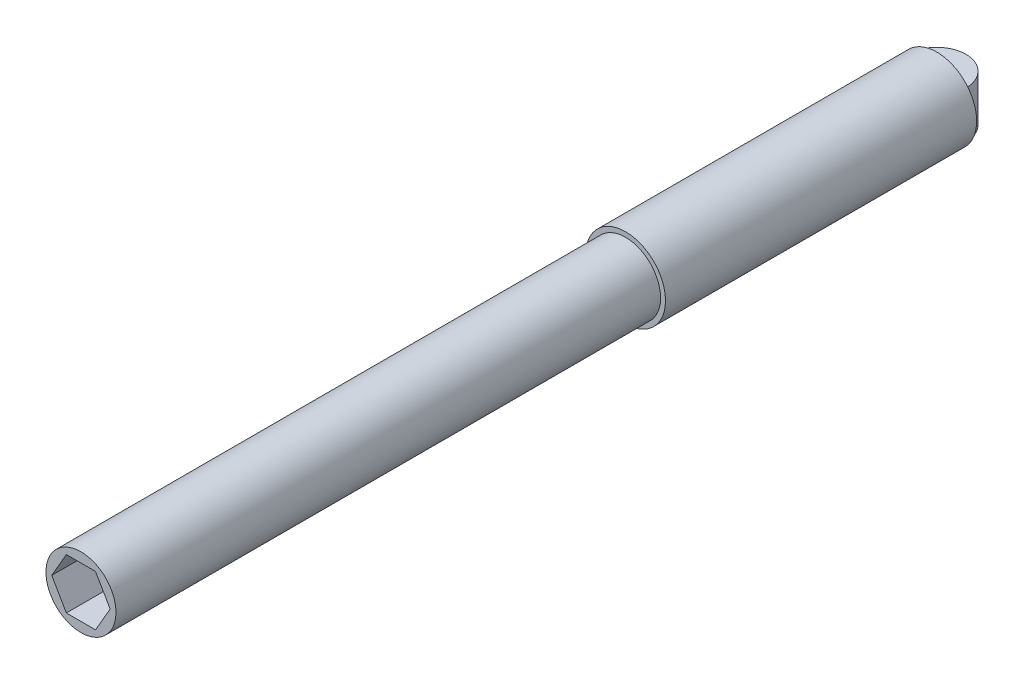
ISO-10303-21;
HEADER;
FILE_DESCRIPTION(('STEP AP214'),'2;1');
FILE_NAME('part.step','',(''),(''),'','','');
FILE_SCHEMA(('AUTOMOTIVE_DESIGN { 1 0 10303 214 1 1 1 1 }'));
ENDSEC;
DATA;
#1=APPLICATION_CONTEXT('core data for automotive mechanical design processes');
#2=APPLICATION_PROTOCOL_DEFINITION('international standard','automotive_design',2000,#1);
#3=PRODUCT_CONTEXT('',#1,'mechanical');
#4=PRODUCT('Part','Part','',(#3));
#5=PRODUCT_RELATED_PRODUCT_CATEGORY('part','',(#4));
#6=PRODUCT_DEFINITION_FORMATION('','',#4);
#7=PRODUCT_DEFINITION_CONTEXT('part definition',#1,'design');
#8=PRODUCT_DEFINITION('design','',#6,#7);
#9=PRODUCT_DEFINITION_SHAPE('','',#8);
#10=(LENGTH_UNIT() NAMED_UNIT(*) SI_UNIT(.MILLI.,.METRE.));
#11=(NAMED_UNIT(*) PLANE_ANGLE_UNIT() SI_UNIT($,.RADIAN.));
#12=(NAMED_UNIT(*) SI_UNIT($,.STERADIAN.) SOLID_ANGLE_UNIT());
#13=UNCERTAINTY_MEASURE_WITH_UNIT(LENGTH_MEASURE(1.E-05),#10,'distance_accuracy_value','');
#14=(GEOMETRIC_REPRESENTATION_CONTEXT(3) GLOBAL_UNCERTAINTY_ASSIGNED_CONTEXT((#13)) GLOBAL_UNIT_ASSIGNED_CONTEXT((#10,
#11,#12)) REPRESENTATION_CONTEXT('',''));
#15=CARTESIAN_POINT('',(0.,0.,0.));
#16=DIRECTION('',(0.,0.,1.));
#17=DIRECTION('',(1.,0.,0.));
#18=AXIS2_PLACEMENT_3D('',#15,#16,#17);
#19=CARTESIAN_POINT('',(0.,0.,2.));
#20=DIRECTION('',(0.,0.,1.));
#21=DIRECTION('',(1.,0.,0.));
#22=AXIS2_PLACEMENT_3D('',#19,#20,#21);
#23=PLANE('',#22);
#24=CARTESIAN_POINT('',(0.,0.,2.));
#25=DIRECTION('',(0.,0.,1.));
#26=DIRECTION('',(1.,0.,0.));
#27=AXIS2_PLACEMENT_3D('',#24,#25,#26);
#28=CIRCLE('',#27,1.025);
#29=CARTESIAN_POINT('',(1.025,0.,2.));
#30=VERTEX_POINT('',#29);
#31=EDGE_CURVE('E204',#30,#30,#28,.T.);
#32=ORIENTED_EDGE('',*,*,#31,.T.);
#33=EDGE_LOOP('',(#32));
#34=FACE_BOUND('',#33,.T.);
#35=CARTESIAN_POINT('',(0.,0.,2.));
#36=DIRECTION('',(0.,0.,1.));
#37=DIRECTION('',(1.,0.,0.));
#38=AXIS2_PLACEMENT_3D('',#35,#36,#37);
#39=CIRCLE('',#38,0.9);
#40=CARTESIAN_POINT('',(0.9,0.,2.));
#41=VERTEX_POINT('',#40);
#42=EDGE_CURVE('E147',#41,#41,#39,.T.);
#43=ORIENTED_EDGE('',*,*,#42,.F.);
#44=EDGE_LOOP('',(#43));
#45=FACE_BOUND('',#44,.T.);
#46=ADVANCED_FACE('F65',(#34,#45),#23,.T.);
#47=CARTESIAN_POINT('',(0.,0.,12.));
#48=DIRECTION('',(0.,0.,-1.));
#49=DIRECTION('',(-1.,0.,0.));
#50=AXIS2_PLACEMENT_3D('',#47,#48,#49);
#51=CYLINDRICAL_SURFACE('',#50,1.025);
#52=CARTESIAN_POINT('',(0.,0.,-6.));
#53=DIRECTION('',(0.,0.,-1.));
#54=DIRECTION('',(-1.,0.,0.));
#55=AXIS2_PLACEMENT_3D('',#52,#53,#54);
#56=CIRCLE('',#55,1.025);
#57=CARTESIAN_POINT('',(-1.025,0.,-6.));
#58=VERTEX_POINT('',#57);
#59=EDGE_CURVE('E12',#58,#58,#56,.T.);
#60=ORIENTED_EDGE('',*,*,#59,.F.);
#61=EDGE_LOOP('',(#60));
#62=FACE_BOUND('',#61,.T.);
#63=ORIENTED_EDGE('',*,*,#31,.F.);
#64=EDGE_LOOP('',(#63));
#65=FACE_BOUND('',#64,.T.);
#66=ADVANCED_FACE('F67',(#62,#65),#51,.T.);
#67=CARTESIAN_POINT('',(0.,0.,-6.));
#68=DIRECTION('',(0.,0.,-1.));
#69=DIRECTION('',(-1.,0.,0.));
#70=AXIS2_PLACEMENT_3D('',#67,#68,#69);
#71=PLANE('',#70);
#72=ORIENTED_EDGE('',*,*,#59,.T.);
#73=EDGE_LOOP('',(#72));
#74=FACE_BOUND('',#73,.T.);
#75=DIRECTION('',(0.,1.,0.));
#76=VECTOR('',#75,1.);
#77=CARTESIAN_POINT('',(-0.75,-0.6,-6.));
#78=LINE('',#77,#76);
#79=CARTESIAN_POINT('',(-0.75,-0.6,-6.));
#80=VERTEX_POINT('',#79);
#81=CARTESIAN_POINT('',(-0.75,0.6,-6.));
#82=VERTEX_POINT('',#81);
#83=EDGE_CURVE('E74',#80,#82,#78,.T.);
#84=ORIENTED_EDGE('',*,*,#83,.F.);
#85=DIRECTION('',(1.,0.,0.));
#86=VECTOR('',#85,1.);
#87=CARTESIAN_POINT('',(0.,-0.6,-6.));
#88=LINE('',#87,#86);
#89=CARTESIAN_POINT('',(0.75,-0.6,-6.));
#90=VERTEX_POINT('',#89);
#91=EDGE_CURVE('E219',#80,#90,#88,.T.);
#92=ORIENTED_EDGE('',*,*,#91,.T.);
#93=DIRECTION('',(0.,1.,0.));
#94=VECTOR('',#93,1.);
#95=CARTESIAN_POINT('',(0.75,-0.6,-6.));
#96=LINE('',#95,#94);
#97=CARTESIAN_POINT('',(0.75,0.6,-6.));
#98=VERTEX_POINT('',#97);
#99=EDGE_CURVE('E226',#90,#98,#96,.T.);
#100=ORIENTED_EDGE('',*,*,#99,.T.);
#101=DIRECTION('',(1.,0.,0.));
#102=VECTOR('',#101,1.);
#103=CARTESIAN_POINT('',(0.,0.6,-6.));
#104=LINE('',#103,#102);
#105=EDGE_CURVE('E211',#82,#98,#104,.T.);
#106=ORIENTED_EDGE('',*,*,#105,.F.);
#107=EDGE_LOOP('',(#84,#92,#100,#106));
#108=FACE_BOUND('',#107,.T.);
#109=ADVANCED_FACE('F233',(#74,#108),#71,.T.);
#110=CARTESIAN_POINT('',(0.,-0.6,-6.));
#111=DIRECTION('',(0.,1.,0.));
#112=DIRECTION('',(0.,0.,1.));
#113=AXIS2_PLACEMENT_3D('',#110,#111,#112);
#114=CYLINDRICAL_SURFACE('',#113,0.75);
#115=ORIENTED_EDGE('',*,*,#83,.T.);
#116=CARTESIAN_POINT('',(0.,0.6,-6.));
#117=DIRECTION('',(0.,1.,0.));
#118=DIRECTION('',(0.,0.,1.));
#119=AXIS2_PLACEMENT_3D('',#116,#117,#118);
#120=CIRCLE('',#119,0.75);
#121=EDGE_CURVE('E215',#98,#82,#120,.T.);
#122=ORIENTED_EDGE('',*,*,#121,.F.);
#123=ORIENTED_EDGE('',*,*,#99,.F.);
#124=CARTESIAN_POINT('',(0.,-0.6,-6.));
#125=DIRECTION('',(0.,1.,0.));
#126=DIRECTION('',(0.,0.,1.));
#127=AXIS2_PLACEMENT_3D('',#124,#125,#126);
#128=CIRCLE('',#127,0.75);
#129=EDGE_CURVE('E222',#90,#80,#128,.T.);
#130=ORIENTED_EDGE('',*,*,#129,.T.);
#131=EDGE_LOOP('',(#115,#122,#123,#130));
#132=FACE_BOUND('',#131,.T.);
#133=ADVANCED_FACE('F237',(#132),#114,.T.);
#134=CARTESIAN_POINT('',(0.,-0.6,0.));
#135=DIRECTION('',(0.,1.,0.));
#136=DIRECTION('',(0.,0.,1.));
#137=AXIS2_PLACEMENT_3D('',#134,#135,#136);
#138=PLANE('',#137);
#139=ORIENTED_EDGE('',*,*,#91,.F.);
#140=ORIENTED_EDGE('',*,*,#129,.F.);
#141=EDGE_LOOP('',(#139,#140));
#142=FACE_BOUND('',#141,.T.);
#143=ADVANCED_FACE('F241',(#142),#138,.F.);
#144=CARTESIAN_POINT('',(0.,0.6,0.));
#145=DIRECTION('',(0.,1.,0.));
#146=DIRECTION('',(0.,0.,1.));
#147=AXIS2_PLACEMENT_3D('',#144,#145,#146);
#148=PLANE('',#147);
#149=ORIENTED_EDGE('',*,*,#105,.T.);
#150=ORIENTED_EDGE('',*,*,#121,.T.);
#151=EDGE_LOOP('',(#149,#150));
#152=FACE_BOUND('',#151,.T.);
#153=ADVANCED_FACE('F239',(#152),#148,.T.);
#154=CARTESIAN_POINT('',(0.,0.,16.));
#155=DIRECTION('',(0.,0.,1.));
#156=DIRECTION('',(1.,0.,0.));
#157=AXIS2_PLACEMENT_3D('',#154,#155,#156);
#158=PLANE('',#157);
#159=CARTESIAN_POINT('',(0.,0.,16.));
#160=DIRECTION('',(0.,0.,1.));
#161=DIRECTION('',(1.,0.,0.));
#162=AXIS2_PLACEMENT_3D('',#159,#160,#161);
#163=CIRCLE('',#162,0.9);
#164=CARTESIAN_POINT('',(0.9,0.,16.));
#165=VERTEX_POINT('',#164);
#166=EDGE_CURVE('E200',#165,#165,#163,.T.);
#167=ORIENTED_EDGE('',*,*,#166,.T.);
#168=EDGE_LOOP('',(#167));
#169=FACE_BOUND('',#168,.T.);
#170=DIRECTION('',(0.5,0.866025403784439,0.));
#171=VECTOR('',#170,1.);
#172=CARTESIAN_POINT('',(0.562916512459886,-0.325,16.));
#173=LINE('',#172,#171);
#174=CARTESIAN_POINT('',(0.375277674973257,-0.65,16.));
#175=VERTEX_POINT('',#174);
#176=CARTESIAN_POINT('',(0.750555349946514,0.,16.));
#177=VERTEX_POINT('',#176);
#178=EDGE_CURVE('E140',#175,#177,#173,.T.);
#179=ORIENTED_EDGE('',*,*,#178,.F.);
#180=DIRECTION('',(1.,0.,0.));
#181=VECTOR('',#180,1.);
#182=CARTESIAN_POINT('',(0.,-0.65,16.));
#183=LINE('',#182,#181);
#184=CARTESIAN_POINT('',(-0.375277674973257,-0.650000000000001,16.));
#185=VERTEX_POINT('',#184);
#186=EDGE_CURVE('E130',#185,#175,#183,.T.);
#187=ORIENTED_EDGE('',*,*,#186,.F.);
#188=DIRECTION('',(0.5,-0.866025403784439,0.));
#189=VECTOR('',#188,1.);
#190=CARTESIAN_POINT('',(-0.562916512459885,-0.325,16.));
#191=LINE('',#190,#189);
#192=CARTESIAN_POINT('',(-0.750555349946514,0.,16.));
#193=VERTEX_POINT('',#192);
#194=EDGE_CURVE('E166',#193,#185,#191,.T.);
#195=ORIENTED_EDGE('',*,*,#194,.F.);
#196=DIRECTION('',(-0.5,-0.866025403784439,0.));
#197=VECTOR('',#196,1.);
#198=CARTESIAN_POINT('',(-0.562916512459886,0.325,16.));
#199=LINE('',#198,#197);
#200=CARTESIAN_POINT('',(-0.375277674973257,0.65,16.));
#201=VERTEX_POINT('',#200);
#202=EDGE_CURVE('E162',#201,#193,#199,.T.);
#203=ORIENTED_EDGE('',*,*,#202,.F.);
#204=DIRECTION('',(-1.,0.,0.));
#205=VECTOR('',#204,1.);
#206=CARTESIAN_POINT('',(0.,0.650000000000001,16.));
#207=LINE('',#206,#205);
#208=CARTESIAN_POINT('',(0.375277674973257,0.650000000000001,16.));
#209=VERTEX_POINT('',#208);
#210=EDGE_CURVE('E157',#209,#201,#207,.T.);
#211=ORIENTED_EDGE('',*,*,#210,.F.);
#212=DIRECTION('',(-0.5,0.866025403784439,0.));
#213=VECTOR('',#212,1.);
#214=CARTESIAN_POINT('',(0.562916512459885,0.325,16.));
#215=LINE('',#214,#213);
#216=EDGE_CURVE('E153',#177,#209,#215,.T.);
#217=ORIENTED_EDGE('',*,*,#216,.F.);
#218=EDGE_LOOP('',(#179,#187,#195,#203,#211,#217));
#219=FACE_BOUND('',#218,.T.);
#220=ADVANCED_FACE('F151',(#169,#219),#158,.T.);
#221=CARTESIAN_POINT('',(0.,0.,16.));
#222=DIRECTION('',(0.,0.,-1.));
#223=DIRECTION('',(-1.,0.,0.));
#224=AXIS2_PLACEMENT_3D('',#221,#222,#223);
#225=CYLINDRICAL_SURFACE('',#224,0.9);
#226=ORIENTED_EDGE('',*,*,#166,.F.);
#227=EDGE_LOOP('',(#226));
#228=FACE_BOUND('',#227,.T.);
#229=ORIENTED_EDGE('',*,*,#42,.T.);
#230=EDGE_LOOP('',(#229));
#231=FACE_BOUND('',#230,.T.);
#232=ADVANCED_FACE('F247',(#228,#231),#225,.T.);
#233=CARTESIAN_POINT('',(0.,-0.65,16.));
#234=DIRECTION('',(0.,1.,0.));
#235=DIRECTION('',(0.,0.,1.));
#236=AXIS2_PLACEMENT_3D('',#233,#234,#235);
#237=PLANE('',#236);
#238=DIRECTION('',(1.,0.,0.));
#239=VECTOR('',#238,1.);
#240=CARTESIAN_POINT('',(0.,-0.65,2.));
#241=LINE('',#240,#239);
#242=CARTESIAN_POINT('',(-0.375277674973257,-0.650000000000001,2.));
#243=VERTEX_POINT('',#242);
#244=CARTESIAN_POINT('',(0.375277674973257,-0.650000000000001,2.));
#245=VERTEX_POINT('',#244);
#246=EDGE_CURVE('E81',#243,#245,#241,.T.);
#247=ORIENTED_EDGE('',*,*,#246,.F.);
#248=DIRECTION('',(0.,0.,-1.));
#249=VECTOR('',#248,1.);
#250=CARTESIAN_POINT('',(-0.375277674973257,-0.650000000000001,16.));
#251=LINE('',#250,#249);
#252=EDGE_CURVE('E135',#185,#243,#251,.T.);
#253=ORIENTED_EDGE('',*,*,#252,.F.);
#254=ORIENTED_EDGE('',*,*,#186,.T.);
#255=DIRECTION('',(0.,0.,-1.));
#256=VECTOR('',#255,1.);
#257=CARTESIAN_POINT('',(0.375277674973257,-0.65,16.));
#258=LINE('',#257,#256);
#259=EDGE_CURVE('E133',#175,#245,#258,.T.);
#260=ORIENTED_EDGE('',*,*,#259,.T.);
#261=EDGE_LOOP('',(#247,#253,#254,#260));
#262=FACE_BOUND('',#261,.T.);
#263=ADVANCED_FACE('F132',(#262),#237,.T.);
#264=CARTESIAN_POINT('',(0.562916512459886,-0.325,16.));
#265=DIRECTION('',(-0.866025403784439,0.5,0.));
#266=DIRECTION('',(-0.5,-0.866025403784439,0.));
#267=AXIS2_PLACEMENT_3D('',#264,#265,#266);
#268=PLANE('',#267);
#269=DIRECTION('',(0.5,0.866025403784439,0.));
#270=VECTOR('',#269,1.);
#271=CARTESIAN_POINT('',(0.562916512459886,-0.325,2.));
#272=LINE('',#271,#270);
#273=CARTESIAN_POINT('',(0.750555349946514,0.,2.));
#274=VERTEX_POINT('',#273);
#275=EDGE_CURVE('E85',#245,#274,#272,.T.);
#276=ORIENTED_EDGE('',*,*,#275,.F.);
#277=ORIENTED_EDGE('',*,*,#259,.F.);
#278=ORIENTED_EDGE('',*,*,#178,.T.);
#279=DIRECTION('',(0.,0.,-1.));
#280=VECTOR('',#279,1.);
#281=CARTESIAN_POINT('',(0.750555349946514,0.,16.));
#282=LINE('',#281,#280);
#283=EDGE_CURVE('E148',#177,#274,#282,.T.);
#284=ORIENTED_EDGE('',*,*,#283,.T.);
#285=EDGE_LOOP('',(#276,#277,#278,#284));
#286=FACE_BOUND('',#285,.T.);
#287=ADVANCED_FACE('F144',(#286),#268,.T.);
#288=CARTESIAN_POINT('',(0.562916512459885,0.325,16.));
#289=DIRECTION('',(-0.866025403784439,-0.5,0.));
#290=DIRECTION('',(0.5,-0.866025403784439,0.));
#291=AXIS2_PLACEMENT_3D('',#288,#289,#290);
#292=PLANE('',#291);
#293=DIRECTION('',(-0.5,0.866025403784439,0.));
#294=VECTOR('',#293,1.);
#295=CARTESIAN_POINT('',(0.562916512459885,0.325,2.));
#296=LINE('',#295,#294);
#297=CARTESIAN_POINT('',(0.375277674973257,0.650000000000001,2.));
#298=VERTEX_POINT('',#297);
#299=EDGE_CURVE('E173',#274,#298,#296,.T.);
#300=ORIENTED_EDGE('',*,*,#299,.F.);
#301=ORIENTED_EDGE('',*,*,#283,.F.);
#302=ORIENTED_EDGE('',*,*,#216,.T.);
#303=DIRECTION('',(0.,0.,-1.));
#304=VECTOR('',#303,1.);
#305=CARTESIAN_POINT('',(0.375277674973257,0.650000000000001,16.));
#306=LINE('',#305,#304);
#307=EDGE_CURVE('E194',#209,#298,#306,.T.);
#308=ORIENTED_EDGE('',*,*,#307,.T.);
#309=EDGE_LOOP('',(#300,#301,#302,#308));
#310=FACE_BOUND('',#309,.T.);
#311=ADVANCED_FACE('F280',(#310),#292,.T.);
#312=CARTESIAN_POINT('',(0.,0.650000000000001,16.));
#313=DIRECTION('',(0.,-1.,0.));
#314=DIRECTION('',(1.,0.,0.));
#315=AXIS2_PLACEMENT_3D('',#312,#313,#314);
#316=PLANE('',#315);
#317=DIRECTION('',(-1.,0.,0.));
#318=VECTOR('',#317,1.);
#319=CARTESIAN_POINT('',(0.,0.650000000000001,2.));
#320=LINE('',#319,#318);
#321=CARTESIAN_POINT('',(-0.375277674973257,0.65,2.));
#322=VERTEX_POINT('',#321);
#323=EDGE_CURVE('E176',#298,#322,#320,.T.);
#324=ORIENTED_EDGE('',*,*,#323,.F.);
#325=ORIENTED_EDGE('',*,*,#307,.F.);
#326=ORIENTED_EDGE('',*,*,#210,.T.);
#327=DIRECTION('',(0.,0.,-1.));
#328=VECTOR('',#327,1.);
#329=CARTESIAN_POINT('',(-0.375277674973257,0.65,16.));
#330=LINE('',#329,#328);
#331=EDGE_CURVE('E190',#201,#322,#330,.T.);
#332=ORIENTED_EDGE('',*,*,#331,.T.);
#333=EDGE_LOOP('',(#324,#325,#326,#332));
#334=FACE_BOUND('',#333,.T.);
#335=ADVANCED_FACE('F273',(#334),#316,.T.);
#336=CARTESIAN_POINT('',(-0.562916512459886,0.325,16.));
#337=DIRECTION('',(0.866025403784439,-0.5,0.));
#338=DIRECTION('',(0.5,0.866025403784439,0.));
#339=AXIS2_PLACEMENT_3D('',#336,#337,#338);
#340=PLANE('',#339);
#341=DIRECTION('',(-0.5,-0.866025403784439,0.));
#342=VECTOR('',#341,1.);
#343=CARTESIAN_POINT('',(-0.562916512459886,0.325,2.));
#344=LINE('',#343,#342);
#345=CARTESIAN_POINT('',(-0.750555349946514,0.,2.));
#346=VERTEX_POINT('',#345);
#347=EDGE_CURVE('E179',#322,#346,#344,.T.);
#348=ORIENTED_EDGE('',*,*,#347,.F.);
#349=ORIENTED_EDGE('',*,*,#331,.F.);
#350=ORIENTED_EDGE('',*,*,#202,.T.);
#351=DIRECTION('',(0.,0.,-1.));
#352=VECTOR('',#351,1.);
#353=CARTESIAN_POINT('',(-0.750555349946514,0.,16.));
#354=LINE('',#353,#352);
#355=EDGE_CURVE('E186',#193,#346,#354,.T.);
#356=ORIENTED_EDGE('',*,*,#355,.T.);
#357=EDGE_LOOP('',(#348,#349,#350,#356));
#358=FACE_BOUND('',#357,.T.);
#359=ADVANCED_FACE('F267',(#358),#340,.T.);
#360=CARTESIAN_POINT('',(-0.562916512459885,-0.325,16.));
#361=DIRECTION('',(0.866025403784439,0.5,0.));
#362=DIRECTION('',(-0.5,0.866025403784439,0.));
#363=AXIS2_PLACEMENT_3D('',#360,#361,#362);
#364=PLANE('',#363);
#365=DIRECTION('',(0.5,-0.866025403784439,0.));
#366=VECTOR('',#365,1.);
#367=CARTESIAN_POINT('',(-0.562916512459885,-0.325,2.));
#368=LINE('',#367,#366);
#369=EDGE_CURVE('E141',#346,#243,#368,.T.);
#370=ORIENTED_EDGE('',*,*,#369,.F.);
#371=ORIENTED_EDGE('',*,*,#355,.F.);
#372=ORIENTED_EDGE('',*,*,#194,.T.);
#373=ORIENTED_EDGE('',*,*,#252,.T.);
#374=EDGE_LOOP('',(#370,#371,#372,#373));
#375=FACE_BOUND('',#374,.T.);
#376=ADVANCED_FACE('F263',(#375),#364,.T.);
#377=ORIENTED_EDGE('',*,*,#246,.T.);
#378=ORIENTED_EDGE('',*,*,#275,.T.);
#379=ORIENTED_EDGE('',*,*,#299,.T.);
#380=ORIENTED_EDGE('',*,*,#323,.T.);
#381=ORIENTED_EDGE('',*,*,#347,.T.);
#382=ORIENTED_EDGE('',*,*,#369,.T.);
#383=EDGE_LOOP('',(#377,#378,#379,#380,#381,#382));
#384=FACE_BOUND('',#383,.T.);
#385=ADVANCED_FACE('F255',(#384),#23,.T.);
#386=CLOSED_SHELL('',(#46,#66,#109,#133,#143,#153,#220,#232,#263,#287,#311,#335,#359,#376,#385));
#387=MANIFOLD_SOLID_BREP('B2',#386);
#388=ADVANCED_BREP_SHAPE_REPRESENTATION('',(#18,#387),#14);
#389=SHAPE_DEFINITION_REPRESENTATION(#9,#388);
ENDSEC;
END-ISO-10303-21;
